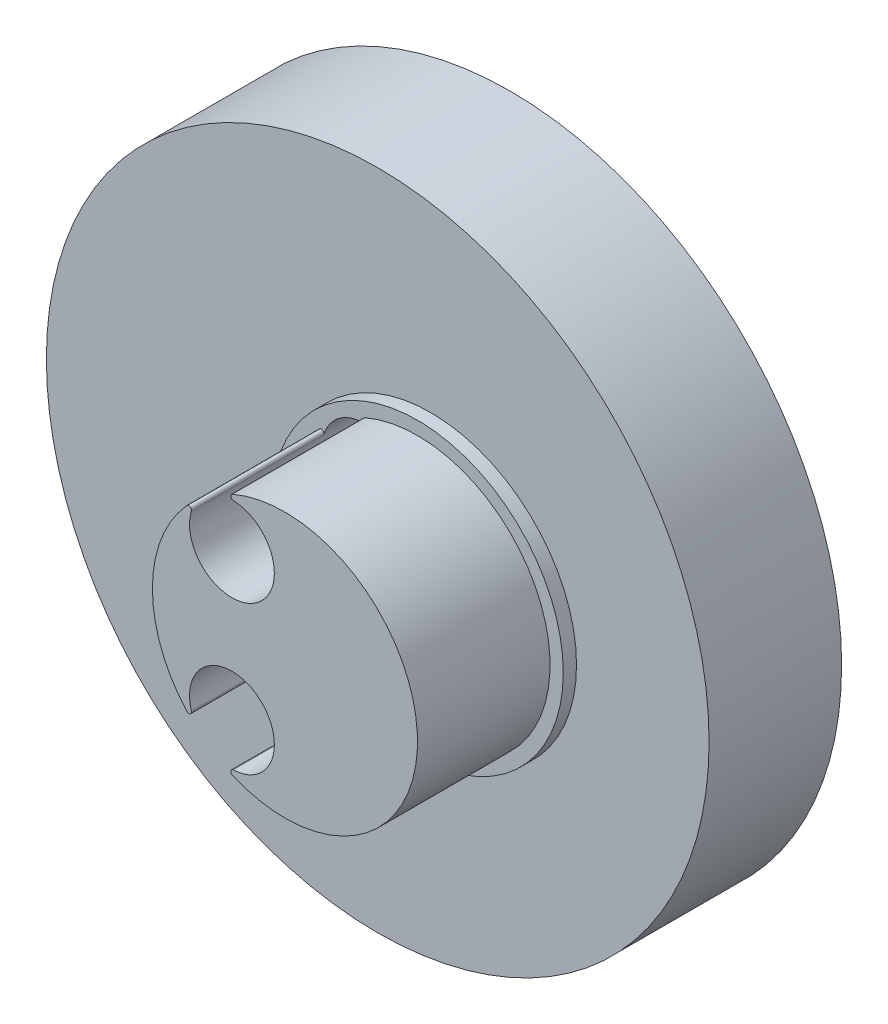
ISO-10303-21;
HEADER;
FILE_DESCRIPTION(('STEP AP214'),'2;1');
FILE_NAME('part.step','',(''),(''),'','','');
FILE_SCHEMA(('AUTOMOTIVE_DESIGN { 1 0 10303 214 1 1 1 1 }'));
ENDSEC;
DATA;
#1=APPLICATION_CONTEXT('core data for automotive mechanical design processes');
#2=APPLICATION_PROTOCOL_DEFINITION('international standard','automotive_design',2000,#1);
#3=PRODUCT_CONTEXT('',#1,'mechanical');
#4=PRODUCT('Part','Part','',(#3));
#5=PRODUCT_RELATED_PRODUCT_CATEGORY('part','',(#4));
#6=PRODUCT_DEFINITION_FORMATION('','',#4);
#7=PRODUCT_DEFINITION_CONTEXT('part definition',#1,'design');
#8=PRODUCT_DEFINITION('design','',#6,#7);
#9=PRODUCT_DEFINITION_SHAPE('','',#8);
#10=(LENGTH_UNIT() NAMED_UNIT(*) SI_UNIT(.MILLI.,.METRE.));
#11=(NAMED_UNIT(*) PLANE_ANGLE_UNIT() SI_UNIT($,.RADIAN.));
#12=(NAMED_UNIT(*) SI_UNIT($,.STERADIAN.) SOLID_ANGLE_UNIT());
#13=UNCERTAINTY_MEASURE_WITH_UNIT(LENGTH_MEASURE(1.E-05),#10,'distance_accuracy_value','');
#14=(GEOMETRIC_REPRESENTATION_CONTEXT(3) GLOBAL_UNCERTAINTY_ASSIGNED_CONTEXT((#13)) GLOBAL_UNIT_ASSIGNED_CONTEXT((#10,
#11,#12)) REPRESENTATION_CONTEXT('',''));
#15=CARTESIAN_POINT('',(0.,0.,0.));
#16=DIRECTION('',(0.,0.,1.));
#17=DIRECTION('',(1.,0.,0.));
#18=AXIS2_PLACEMENT_3D('',#15,#16,#17);
#19=CARTESIAN_POINT('',(0.,0.,8.5));
#20=DIRECTION('',(0.,0.,1.));
#21=DIRECTION('',(1.,0.,0.));
#22=AXIS2_PLACEMENT_3D('',#19,#20,#21);
#23=PLANE('',#22);
#24=CARTESIAN_POINT('',(0.,-2.8,8.5));
#25=DIRECTION('',(0.,0.,1.));
#26=DIRECTION('',(1.,0.,0.));
#27=AXIS2_PLACEMENT_3D('',#24,#25,#26);
#28=CIRCLE('',#27,1.6);
#29=CARTESIAN_POINT('',(-1.5304977196884,-3.26645120862593,8.5));
#30=VERTEX_POINT('',#29);
#31=CARTESIAN_POINT('',(0.0551400090365775,-4.39904958628663,8.5));
#32=VERTEX_POINT('',#31);
#33=EDGE_CURVE('E152',#30,#32,#28,.F.);
#34=ORIENTED_EDGE('',*,*,#33,.T.);
#35=CARTESIAN_POINT('',(0.0585862596013635,-4.49899018542955,8.5));
#36=DIRECTION('',(0.,0.,1.));
#37=DIRECTION('',(1.,0.,0.));
#38=AXIS2_PLACEMENT_3D('',#35,#36,#37);
#39=CIRCLE('',#38,0.1);
#40=CARTESIAN_POINT('',(0.0189655710217994,-4.5908063116628,8.5));
#41=VERTEX_POINT('',#40);
#42=EDGE_CURVE('E166',#32,#41,#39,.T.);
#43=ORIENTED_EDGE('',*,*,#42,.T.);
#44=CARTESIAN_POINT('',(2.,0.,8.5));
#45=DIRECTION('',(0.,0.,1.));
#46=DIRECTION('',(1.,0.,0.));
#47=AXIS2_PLACEMENT_3D('',#44,#45,#46);
#48=CIRCLE('',#47,5.);
#49=CARTESIAN_POINT('',(0.0189655710218016,4.5908063116628,8.5));
#50=VERTEX_POINT('',#49);
#51=EDGE_CURVE('E121',#41,#50,#48,.T.);
#52=ORIENTED_EDGE('',*,*,#51,.T.);
#53=CARTESIAN_POINT('',(0.0585862596013656,4.49899018542955,8.5));
#54=DIRECTION('',(0.,0.,1.));
#55=DIRECTION('',(1.,0.,0.));
#56=AXIS2_PLACEMENT_3D('',#53,#54,#55);
#57=CIRCLE('',#56,0.1);
#58=CARTESIAN_POINT('',(0.0551400090365794,4.39904958628663,8.5));
#59=VERTEX_POINT('',#58);
#60=EDGE_CURVE('E162',#50,#59,#57,.T.);
#61=ORIENTED_EDGE('',*,*,#60,.T.);
#62=CARTESIAN_POINT('',(0.,2.8,8.5));
#63=DIRECTION('',(0.,0.,1.));
#64=DIRECTION('',(1.,0.,0.));
#65=AXIS2_PLACEMENT_3D('',#62,#63,#64);
#66=CIRCLE('',#65,1.6);
#67=CARTESIAN_POINT('',(-1.53049771968841,3.26645120862593,8.5));
#68=VERTEX_POINT('',#67);
#69=EDGE_CURVE('E149',#59,#68,#66,.F.);
#70=ORIENTED_EDGE('',*,*,#69,.T.);
#71=CARTESIAN_POINT('',(-1.62615382716893,3.29560440916505,8.5));
#72=DIRECTION('',(0.,0.,1.));
#73=DIRECTION('',(1.,0.,0.));
#74=AXIS2_PLACEMENT_3D('',#71,#72,#73);
#75=CIRCLE('',#74,0.1);
#76=CARTESIAN_POINT('',(-1.70015696649891,3.36286164200515,8.5));
#77=VERTEX_POINT('',#76);
#78=EDGE_CURVE('E160',#68,#77,#75,.T.);
#79=ORIENTED_EDGE('',*,*,#78,.T.);
#80=CARTESIAN_POINT('',(-1.70015696649891,-3.36286164200515,8.5));
#81=VERTEX_POINT('',#80);
#82=EDGE_CURVE('E146',#77,#81,#48,.T.);
#83=ORIENTED_EDGE('',*,*,#82,.T.);
#84=CARTESIAN_POINT('',(-1.62615382716893,-3.29560440916505,8.5));
#85=DIRECTION('',(0.,0.,1.));
#86=DIRECTION('',(1.,0.,0.));
#87=AXIS2_PLACEMENT_3D('',#84,#85,#86);
#88=CIRCLE('',#87,0.1);
#89=EDGE_CURVE('E164',#81,#30,#88,.T.);
#90=ORIENTED_EDGE('',*,*,#89,.T.);
#91=EDGE_LOOP('',(#34,#43,#52,#61,#70,#79,#83,#90));
#92=FACE_BOUND('',#91,.T.);
#93=ADVANCED_FACE('F41',(#92),#23,.T.);
#94=CARTESIAN_POINT('',(0.,0.,3.));
#95=DIRECTION('',(0.,0.,1.));
#96=DIRECTION('',(1.,0.,0.));
#97=AXIS2_PLACEMENT_3D('',#94,#95,#96);
#98=PLANE('',#97);
#99=CARTESIAN_POINT('',(2.,0.,3.));
#100=DIRECTION('',(0.,0.,1.));
#101=DIRECTION('',(1.,0.,0.));
#102=AXIS2_PLACEMENT_3D('',#99,#100,#101);
#103=CIRCLE('',#102,5.49945445757595);
#104=CARTESIAN_POINT('',(7.49945445757595,0.,3.));
#105=VERTEX_POINT('',#104);
#106=EDGE_CURVE('E128',#105,#105,#103,.T.);
#107=ORIENTED_EDGE('',*,*,#106,.F.);
#108=EDGE_LOOP('',(#107));
#109=FACE_BOUND('',#108,.T.);
#110=CARTESIAN_POINT('',(0.,0.,3.));
#111=DIRECTION('',(0.,0.,1.));
#112=DIRECTION('',(1.,0.,0.));
#113=AXIS2_PLACEMENT_3D('',#110,#111,#112);
#114=CIRCLE('',#113,12.5);
#115=CARTESIAN_POINT('',(12.5,0.,3.));
#116=VERTEX_POINT('',#115);
#117=EDGE_CURVE('E155',#116,#116,#114,.F.);
#118=ORIENTED_EDGE('',*,*,#117,.F.);
#119=EDGE_LOOP('',(#118));
#120=FACE_BOUND('',#119,.T.);
#121=ADVANCED_FACE('F205',(#109,#120),#98,.T.);
#122=CARTESIAN_POINT('',(2.,0.,3.5));
#123=DIRECTION('',(0.,0.,-1.));
#124=DIRECTION('',(-1.,0.,0.));
#125=AXIS2_PLACEMENT_3D('',#122,#123,#124);
#126=CYLINDRICAL_SURFACE('',#125,5.49945445757595);
#127=CARTESIAN_POINT('',(2.,0.,3.5));
#128=DIRECTION('',(0.,0.,1.));
#129=DIRECTION('',(1.,0.,0.));
#130=AXIS2_PLACEMENT_3D('',#127,#128,#129);
#131=CIRCLE('',#130,5.49945445757595);
#132=CARTESIAN_POINT('',(7.49945445757595,0.,3.5));
#133=VERTEX_POINT('',#132);
#134=EDGE_CURVE('E134',#133,#133,#131,.T.);
#135=ORIENTED_EDGE('',*,*,#134,.F.);
#136=EDGE_LOOP('',(#135));
#137=FACE_BOUND('',#136,.T.);
#138=ORIENTED_EDGE('',*,*,#106,.T.);
#139=EDGE_LOOP('',(#138));
#140=FACE_BOUND('',#139,.T.);
#141=ADVANCED_FACE('F208',(#137,#140),#126,.T.);
#142=CARTESIAN_POINT('',(0.,0.,38.3553390593274));
#143=DIRECTION('',(0.,0.,-1.));
#144=DIRECTION('',(-1.,0.,0.));
#145=AXIS2_PLACEMENT_3D('',#142,#143,#144);
#146=CYLINDRICAL_SURFACE('',#145,12.5);
#147=CARTESIAN_POINT('',(0.,0.,-2.));
#148=DIRECTION('',(0.,0.,-1.));
#149=DIRECTION('',(-1.,0.,0.));
#150=AXIS2_PLACEMENT_3D('',#147,#148,#149);
#151=CIRCLE('',#150,12.5);
#152=CARTESIAN_POINT('',(-12.5,0.,-2.));
#153=VERTEX_POINT('',#152);
#154=EDGE_CURVE('E329',#153,#153,#151,.T.);
#155=ORIENTED_EDGE('',*,*,#154,.F.);
#156=EDGE_LOOP('',(#155));
#157=FACE_BOUND('',#156,.T.);
#158=ORIENTED_EDGE('',*,*,#117,.T.);
#159=EDGE_LOOP('',(#158));
#160=FACE_BOUND('',#159,.T.);
#161=ADVANCED_FACE('F214',(#157,#160),#146,.T.);
#162=CARTESIAN_POINT('',(2.,0.,8.5));
#163=DIRECTION('',(0.,0.,-1.));
#164=DIRECTION('',(-1.,0.,0.));
#165=AXIS2_PLACEMENT_3D('',#162,#163,#164);
#166=CYLINDRICAL_SURFACE('',#165,5.);
#167=CARTESIAN_POINT('',(2.,0.,3.5));
#168=DIRECTION('',(0.,0.,1.));
#169=DIRECTION('',(1.,0.,0.));
#170=AXIS2_PLACEMENT_3D('',#167,#168,#169);
#171=CIRCLE('',#170,5.);
#172=CARTESIAN_POINT('',(-1.70015696649891,3.36286164200515,3.5));
#173=VERTEX_POINT('',#172);
#174=CARTESIAN_POINT('',(-1.70015696649891,-3.36286164200515,3.5));
#175=VERTEX_POINT('',#174);
#176=EDGE_CURVE('E129',#173,#175,#171,.T.);
#177=ORIENTED_EDGE('',*,*,#176,.T.);
#178=DIRECTION('',(0.,0.,-1.));
#179=VECTOR('',#178,1.);
#180=CARTESIAN_POINT('',(-1.70015696649891,-3.36286164200515,8.5));
#181=LINE('',#180,#179);
#182=EDGE_CURVE('E171',#175,#81,#181,.F.);
#183=ORIENTED_EDGE('',*,*,#182,.T.);
#184=ORIENTED_EDGE('',*,*,#82,.F.);
#185=DIRECTION('',(0.,0.,-1.));
#186=VECTOR('',#185,1.);
#187=CARTESIAN_POINT('',(-1.70015696649891,3.36286164200515,8.5));
#188=LINE('',#187,#186);
#189=EDGE_CURVE('E168',#77,#173,#188,.T.);
#190=ORIENTED_EDGE('',*,*,#189,.T.);
#191=EDGE_LOOP('',(#177,#183,#184,#190));
#192=FACE_BOUND('',#191,.T.);
#193=ADVANCED_FACE('F183',(#192),#166,.T.);
#194=CARTESIAN_POINT('',(0.,0.,3.5));
#195=DIRECTION('',(0.,0.,1.));
#196=DIRECTION('',(1.,0.,0.));
#197=AXIS2_PLACEMENT_3D('',#194,#195,#196);
#198=PLANE('',#197);
#199=CARTESIAN_POINT('',(0.,2.8,3.5));
#200=DIRECTION('',(0.,0.,1.));
#201=DIRECTION('',(1.,0.,0.));
#202=AXIS2_PLACEMENT_3D('',#199,#200,#201);
#203=CIRCLE('',#202,1.6);
#204=CARTESIAN_POINT('',(0.0551400090365794,4.39904958628663,3.5));
#205=VERTEX_POINT('',#204);
#206=CARTESIAN_POINT('',(-1.53049771968841,3.26645120862593,3.5));
#207=VERTEX_POINT('',#206);
#208=EDGE_CURVE('E55',#205,#207,#203,.T.);
#209=ORIENTED_EDGE('',*,*,#208,.F.);
#210=CARTESIAN_POINT('',(0.0585862596013656,4.49899018542955,3.5));
#211=DIRECTION('',(0.,0.,1.));
#212=DIRECTION('',(1.,0.,0.));
#213=AXIS2_PLACEMENT_3D('',#210,#211,#212);
#214=CIRCLE('',#213,0.1);
#215=CARTESIAN_POINT('',(0.0189655710218016,4.5908063116628,3.5));
#216=VERTEX_POINT('',#215);
#217=EDGE_CURVE('E49',#205,#216,#214,.F.);
#218=ORIENTED_EDGE('',*,*,#217,.T.);
#219=CARTESIAN_POINT('',(0.0189655710217994,-4.5908063116628,3.5));
#220=VERTEX_POINT('',#219);
#221=EDGE_CURVE('E118',#220,#216,#171,.T.);
#222=ORIENTED_EDGE('',*,*,#221,.F.);
#223=CARTESIAN_POINT('',(0.0585862596013635,-4.49899018542955,3.5));
#224=DIRECTION('',(0.,0.,1.));
#225=DIRECTION('',(1.,0.,0.));
#226=AXIS2_PLACEMENT_3D('',#223,#224,#225);
#227=CIRCLE('',#226,0.1);
#228=CARTESIAN_POINT('',(0.0551400090365775,-4.39904958628663,3.5));
#229=VERTEX_POINT('',#228);
#230=EDGE_CURVE('E103',#220,#229,#227,.F.);
#231=ORIENTED_EDGE('',*,*,#230,.T.);
#232=CARTESIAN_POINT('',(0.,-2.8,3.5));
#233=DIRECTION('',(0.,0.,1.));
#234=DIRECTION('',(1.,0.,0.));
#235=AXIS2_PLACEMENT_3D('',#232,#233,#234);
#236=CIRCLE('',#235,1.6);
#237=CARTESIAN_POINT('',(-1.5304977196884,-3.26645120862593,3.5));
#238=VERTEX_POINT('',#237);
#239=EDGE_CURVE('E138',#238,#229,#236,.T.);
#240=ORIENTED_EDGE('',*,*,#239,.F.);
#241=CARTESIAN_POINT('',(-1.62615382716893,-3.29560440916505,3.5));
#242=DIRECTION('',(0.,0.,1.));
#243=DIRECTION('',(1.,0.,0.));
#244=AXIS2_PLACEMENT_3D('',#241,#242,#243);
#245=CIRCLE('',#244,0.1);
#246=EDGE_CURVE('E110',#238,#175,#245,.F.);
#247=ORIENTED_EDGE('',*,*,#246,.T.);
#248=ORIENTED_EDGE('',*,*,#176,.F.);
#249=CARTESIAN_POINT('',(-1.62615382716893,3.29560440916505,3.5));
#250=DIRECTION('',(0.,0.,1.));
#251=DIRECTION('',(1.,0.,0.));
#252=AXIS2_PLACEMENT_3D('',#249,#250,#251);
#253=CIRCLE('',#252,0.1);
#254=EDGE_CURVE('E11',#173,#207,#253,.F.);
#255=ORIENTED_EDGE('',*,*,#254,.T.);
#256=EDGE_LOOP('',(#209,#218,#222,#231,#240,#247,#248,#255));
#257=FACE_BOUND('',#256,.T.);
#258=ORIENTED_EDGE('',*,*,#134,.T.);
#259=EDGE_LOOP('',(#258));
#260=FACE_BOUND('',#259,.T.);
#261=ADVANCED_FACE('F125',(#257,#260),#198,.T.);
#262=ORIENTED_EDGE('',*,*,#51,.F.);
#263=DIRECTION('',(0.,0.,-1.));
#264=VECTOR('',#263,1.);
#265=CARTESIAN_POINT('',(0.0189655710217994,-4.5908063116628,8.5));
#266=LINE('',#265,#264);
#267=EDGE_CURVE('E107',#41,#220,#266,.T.);
#268=ORIENTED_EDGE('',*,*,#267,.T.);
#269=ORIENTED_EDGE('',*,*,#221,.T.);
#270=DIRECTION('',(0.,0.,-1.));
#271=VECTOR('',#270,1.);
#272=CARTESIAN_POINT('',(0.0189655710218016,4.5908063116628,8.5));
#273=LINE('',#272,#271);
#274=EDGE_CURVE('E123',#216,#50,#273,.F.);
#275=ORIENTED_EDGE('',*,*,#274,.T.);
#276=EDGE_LOOP('',(#262,#268,#269,#275));
#277=FACE_BOUND('',#276,.T.);
#278=ADVANCED_FACE('F116',(#277),#166,.T.);
#279=CARTESIAN_POINT('',(0.,0.,-2.));
#280=DIRECTION('',(0.,0.,-1.));
#281=DIRECTION('',(-1.,0.,0.));
#282=AXIS2_PLACEMENT_3D('',#279,#280,#281);
#283=PLANE('',#282);
#284=CARTESIAN_POINT('',(0.,2.8,-2.));
#285=DIRECTION('',(0.,0.,1.));
#286=DIRECTION('',(1.,0.,0.));
#287=AXIS2_PLACEMENT_3D('',#284,#285,#286);
#288=CIRCLE('',#287,1.6);
#289=CARTESIAN_POINT('',(1.6,2.8,-2.));
#290=VERTEX_POINT('',#289);
#291=EDGE_CURVE('E140',#290,#290,#288,.T.);
#292=ORIENTED_EDGE('',*,*,#291,.T.);
#293=EDGE_LOOP('',(#292));
#294=FACE_BOUND('',#293,.T.);
#295=CARTESIAN_POINT('',(0.,-2.8,-2.));
#296=DIRECTION('',(0.,0.,1.));
#297=DIRECTION('',(1.,0.,0.));
#298=AXIS2_PLACEMENT_3D('',#295,#296,#297);
#299=CIRCLE('',#298,1.6);
#300=CARTESIAN_POINT('',(1.6,-2.8,-2.));
#301=VERTEX_POINT('',#300);
#302=EDGE_CURVE('E141',#301,#301,#299,.T.);
#303=ORIENTED_EDGE('',*,*,#302,.T.);
#304=EDGE_LOOP('',(#303));
#305=FACE_BOUND('',#304,.T.);
#306=ORIENTED_EDGE('',*,*,#154,.T.);
#307=EDGE_LOOP('',(#306));
#308=FACE_BOUND('',#307,.T.);
#309=ADVANCED_FACE('F200',(#294,#305,#308),#283,.T.);
#310=CARTESIAN_POINT('',(0.,2.8,-2.));
#311=DIRECTION('',(0.,0.,1.));
#312=DIRECTION('',(1.,0.,0.));
#313=AXIS2_PLACEMENT_3D('',#310,#311,#312);
#314=CYLINDRICAL_SURFACE('',#313,1.6);
#315=ORIENTED_EDGE('',*,*,#291,.F.);
#316=EDGE_LOOP('',(#315));
#317=FACE_BOUND('',#316,.T.);
#318=ORIENTED_EDGE('',*,*,#69,.F.);
#319=DIRECTION('',(0.,0.,1.));
#320=VECTOR('',#319,1.);
#321=CARTESIAN_POINT('',(0.0551400090365794,4.39904958628663,-2.));
#322=LINE('',#321,#320);
#323=EDGE_CURVE('E111',#59,#205,#322,.F.);
#324=ORIENTED_EDGE('',*,*,#323,.T.);
#325=ORIENTED_EDGE('',*,*,#208,.T.);
#326=DIRECTION('',(0.,0.,1.));
#327=VECTOR('',#326,1.);
#328=CARTESIAN_POINT('',(-1.53049771968841,3.26645120862593,-2.));
#329=LINE('',#328,#327);
#330=EDGE_CURVE('E174',#207,#68,#329,.T.);
#331=ORIENTED_EDGE('',*,*,#330,.T.);
#332=EDGE_LOOP('',(#318,#324,#325,#331));
#333=FACE_BOUND('',#332,.T.);
#334=ADVANCED_FACE('F192',(#317,#333),#314,.F.);
#335=CARTESIAN_POINT('',(0.,-2.8,-2.));
#336=DIRECTION('',(0.,0.,1.));
#337=DIRECTION('',(1.,0.,0.));
#338=AXIS2_PLACEMENT_3D('',#335,#336,#337);
#339=CYLINDRICAL_SURFACE('',#338,1.6);
#340=ORIENTED_EDGE('',*,*,#302,.F.);
#341=EDGE_LOOP('',(#340));
#342=FACE_BOUND('',#341,.T.);
#343=ORIENTED_EDGE('',*,*,#239,.T.);
#344=DIRECTION('',(0.,0.,1.));
#345=VECTOR('',#344,1.);
#346=CARTESIAN_POINT('',(0.0551400090365775,-4.39904958628663,-2.));
#347=LINE('',#346,#345);
#348=EDGE_CURVE('E108',#229,#32,#347,.T.);
#349=ORIENTED_EDGE('',*,*,#348,.T.);
#350=ORIENTED_EDGE('',*,*,#33,.F.);
#351=DIRECTION('',(0.,0.,1.));
#352=VECTOR('',#351,1.);
#353=CARTESIAN_POINT('',(-1.5304977196884,-3.26645120862593,-2.));
#354=LINE('',#353,#352);
#355=EDGE_CURVE('E122',#30,#238,#354,.F.);
#356=ORIENTED_EDGE('',*,*,#355,.T.);
#357=EDGE_LOOP('',(#343,#349,#350,#356));
#358=FACE_BOUND('',#357,.T.);
#359=ADVANCED_FACE('F190',(#342,#358),#339,.F.);
#360=CARTESIAN_POINT('',(0.0585862596013635,-4.49899018542955,-2.));
#361=DIRECTION('',(0.,0.,1.));
#362=DIRECTION('',(1.,0.,0.));
#363=AXIS2_PLACEMENT_3D('',#360,#361,#362);
#364=CYLINDRICAL_SURFACE('',#363,0.1);
#365=ORIENTED_EDGE('',*,*,#42,.F.);
#366=ORIENTED_EDGE('',*,*,#348,.F.);
#367=ORIENTED_EDGE('',*,*,#230,.F.);
#368=ORIENTED_EDGE('',*,*,#267,.F.);
#369=EDGE_LOOP('',(#365,#366,#367,#368));
#370=FACE_BOUND('',#369,.T.);
#371=ADVANCED_FACE('F106',(#370),#364,.T.);
#372=CARTESIAN_POINT('',(-1.62615382716893,-3.29560440916505,-2.));
#373=DIRECTION('',(0.,0.,-1.));
#374=DIRECTION('',(-1.,0.,0.));
#375=AXIS2_PLACEMENT_3D('',#372,#373,#374);
#376=CYLINDRICAL_SURFACE('',#375,0.1);
#377=ORIENTED_EDGE('',*,*,#246,.F.);
#378=ORIENTED_EDGE('',*,*,#355,.F.);
#379=ORIENTED_EDGE('',*,*,#89,.F.);
#380=ORIENTED_EDGE('',*,*,#182,.F.);
#381=EDGE_LOOP('',(#377,#378,#379,#380));
#382=FACE_BOUND('',#381,.T.);
#383=ADVANCED_FACE('F186',(#382),#376,.T.);
#384=CARTESIAN_POINT('',(0.0585862596013656,4.49899018542955,-2.));
#385=DIRECTION('',(0.,0.,-1.));
#386=DIRECTION('',(-1.,0.,0.));
#387=AXIS2_PLACEMENT_3D('',#384,#385,#386);
#388=CYLINDRICAL_SURFACE('',#387,0.1);
#389=ORIENTED_EDGE('',*,*,#217,.F.);
#390=ORIENTED_EDGE('',*,*,#323,.F.);
#391=ORIENTED_EDGE('',*,*,#60,.F.);
#392=ORIENTED_EDGE('',*,*,#274,.F.);
#393=EDGE_LOOP('',(#389,#390,#391,#392));
#394=FACE_BOUND('',#393,.T.);
#395=ADVANCED_FACE('F266',(#394),#388,.T.);
#396=CARTESIAN_POINT('',(-1.62615382716893,3.29560440916505,-2.));
#397=DIRECTION('',(0.,0.,1.));
#398=DIRECTION('',(1.,0.,0.));
#399=AXIS2_PLACEMENT_3D('',#396,#397,#398);
#400=CYLINDRICAL_SURFACE('',#399,0.1);
#401=ORIENTED_EDGE('',*,*,#78,.F.);
#402=ORIENTED_EDGE('',*,*,#330,.F.);
#403=ORIENTED_EDGE('',*,*,#254,.F.);
#404=ORIENTED_EDGE('',*,*,#189,.F.);
#405=EDGE_LOOP('',(#401,#402,#403,#404));
#406=FACE_BOUND('',#405,.T.);
#407=ADVANCED_FACE('F43',(#406),#400,.T.);
#408=CLOSED_SHELL('',(#93,#121,#141,#161,#193,#261,#278,#309,#334,#359,#371,#383,#395,#407));
#409=MANIFOLD_SOLID_BREP('B2',#408);
#410=ADVANCED_BREP_SHAPE_REPRESENTATION('',(#18,#409),#14);
#411=SHAPE_DEFINITION_REPRESENTATION(#9,#410);
ENDSEC;
END-ISO-10303-21;
